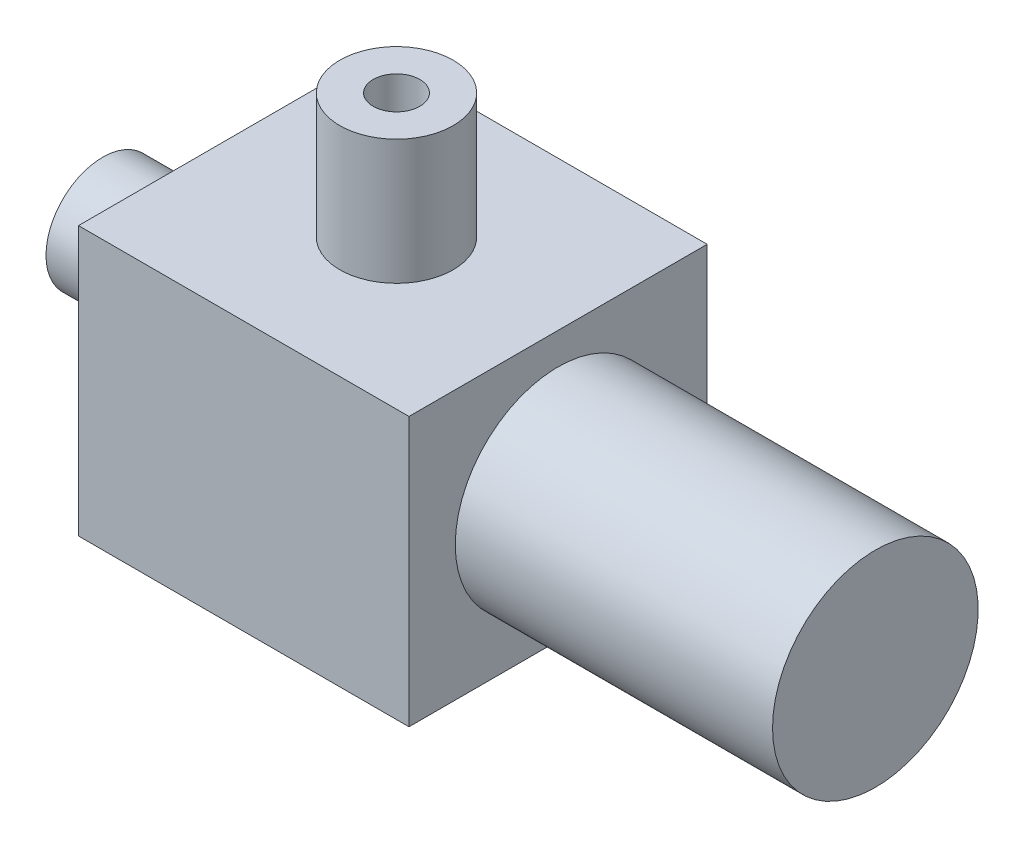
ISO-10303-21;
HEADER;
FILE_DESCRIPTION(('STEP AP214'),'2;1');
FILE_NAME('part.step','',(''),(''),'','','');
FILE_SCHEMA(('AUTOMOTIVE_DESIGN { 1 0 10303 214 1 1 1 1 }'));
ENDSEC;
DATA;
#1=APPLICATION_CONTEXT('core data for automotive mechanical design processes');
#2=APPLICATION_PROTOCOL_DEFINITION('international standard','automotive_design',2000,#1);
#3=PRODUCT_CONTEXT('',#1,'mechanical');
#4=PRODUCT('Part','Part','',(#3));
#5=PRODUCT_RELATED_PRODUCT_CATEGORY('part','',(#4));
#6=PRODUCT_DEFINITION_FORMATION('','',#4);
#7=PRODUCT_DEFINITION_CONTEXT('part definition',#1,'design');
#8=PRODUCT_DEFINITION('design','',#6,#7);
#9=PRODUCT_DEFINITION_SHAPE('','',#8);
#10=(LENGTH_UNIT() NAMED_UNIT(*) SI_UNIT(.MILLI.,.METRE.));
#11=(NAMED_UNIT(*) PLANE_ANGLE_UNIT() SI_UNIT($,.RADIAN.));
#12=(NAMED_UNIT(*) SI_UNIT($,.STERADIAN.) SOLID_ANGLE_UNIT());
#13=UNCERTAINTY_MEASURE_WITH_UNIT(LENGTH_MEASURE(1.E-05),#10,'distance_accuracy_value','');
#14=(GEOMETRIC_REPRESENTATION_CONTEXT(3) GLOBAL_UNCERTAINTY_ASSIGNED_CONTEXT((#13)) GLOBAL_UNIT_ASSIGNED_CONTEXT((#10,
#11,#12)) REPRESENTATION_CONTEXT('',''));
#15=CARTESIAN_POINT('',(0.,0.,0.));
#16=DIRECTION('',(0.,0.,1.));
#17=DIRECTION('',(1.,0.,0.));
#18=AXIS2_PLACEMENT_3D('',#15,#16,#17);
#19=CARTESIAN_POINT('',(17.,18.3,20.3));
#20=DIRECTION('',(1.,0.,0.));
#21=DIRECTION('',(0.,0.,-1.));
#22=AXIS2_PLACEMENT_3D('',#19,#20,#21);
#23=PLANE('',#22);
#24=CARTESIAN_POINT('',(16.9999999999999,0.,0.));
#25=DIRECTION('',(-1.,0.,0.));
#26=DIRECTION('',(0.,0.,1.));
#27=AXIS2_PLACEMENT_3D('',#24,#25,#26);
#28=CIRCLE('',#27,7.722);
#29=CARTESIAN_POINT('',(16.9999999999999,0.,7.722));
#30=VERTEX_POINT('',#29);
#31=EDGE_CURVE('E11',#30,#30,#28,.T.);
#32=ORIENTED_EDGE('',*,*,#31,.F.);
#33=EDGE_LOOP('',(#32));
#34=FACE_BOUND('',#33,.T.);
#35=DIRECTION('',(0.,-1.,0.));
#36=VECTOR('',#35,1.);
#37=CARTESIAN_POINT('',(17.,18.3,-20.3));
#38=LINE('',#37,#36);
#39=CARTESIAN_POINT('',(17.,18.3,-20.3));
#40=VERTEX_POINT('',#39);
#41=CARTESIAN_POINT('',(17.,-18.3,-20.3));
#42=VERTEX_POINT('',#41);
#43=EDGE_CURVE('E107',#40,#42,#38,.T.);
#44=ORIENTED_EDGE('',*,*,#43,.T.);
#45=DIRECTION('',(0.,0.,-1.));
#46=VECTOR('',#45,1.);
#47=CARTESIAN_POINT('',(17.,-18.3,20.3));
#48=LINE('',#47,#46);
#49=CARTESIAN_POINT('',(17.,-18.3,20.3));
#50=VERTEX_POINT('',#49);
#51=EDGE_CURVE('E49',#50,#42,#48,.T.);
#52=ORIENTED_EDGE('',*,*,#51,.F.);
#53=DIRECTION('',(0.,-1.,0.));
#54=VECTOR('',#53,1.);
#55=CARTESIAN_POINT('',(17.,18.3,20.3));
#56=LINE('',#55,#54);
#57=CARTESIAN_POINT('',(17.,18.3,20.3));
#58=VERTEX_POINT('',#57);
#59=EDGE_CURVE('E93',#58,#50,#56,.T.);
#60=ORIENTED_EDGE('',*,*,#59,.F.);
#61=DIRECTION('',(0.,0.,-1.));
#62=VECTOR('',#61,1.);
#63=CARTESIAN_POINT('',(17.,18.3,20.3));
#64=LINE('',#63,#62);
#65=EDGE_CURVE('E102',#58,#40,#64,.T.);
#66=ORIENTED_EDGE('',*,*,#65,.T.);
#67=EDGE_LOOP('',(#44,#52,#60,#66));
#68=FACE_BOUND('',#67,.T.);
#69=ADVANCED_FACE('F41',(#34,#68),#23,.F.);
#70=CARTESIAN_POINT('',(17.,-18.3,20.3));
#71=DIRECTION('',(0.,1.,0.));
#72=DIRECTION('',(0.,0.,1.));
#73=AXIS2_PLACEMENT_3D('',#70,#71,#72);
#74=PLANE('',#73);
#75=DIRECTION('',(1.,0.,0.));
#76=VECTOR('',#75,1.);
#77=CARTESIAN_POINT('',(17.,-18.3,-20.3));
#78=LINE('',#77,#76);
#79=CARTESIAN_POINT('',(62.,-18.3,-20.3));
#80=VERTEX_POINT('',#79);
#81=EDGE_CURVE('E99',#42,#80,#78,.T.);
#82=ORIENTED_EDGE('',*,*,#81,.T.);
#83=DIRECTION('',(0.,0.,-1.));
#84=VECTOR('',#83,1.);
#85=CARTESIAN_POINT('',(62.,-18.3,20.3));
#86=LINE('',#85,#84);
#87=CARTESIAN_POINT('',(62.,-18.3,20.3));
#88=VERTEX_POINT('',#87);
#89=EDGE_CURVE('E96',#88,#80,#86,.T.);
#90=ORIENTED_EDGE('',*,*,#89,.F.);
#91=DIRECTION('',(1.,0.,0.));
#92=VECTOR('',#91,1.);
#93=CARTESIAN_POINT('',(17.,-18.3,20.3));
#94=LINE('',#93,#92);
#95=EDGE_CURVE('E90',#50,#88,#94,.T.);
#96=ORIENTED_EDGE('',*,*,#95,.F.);
#97=ORIENTED_EDGE('',*,*,#51,.T.);
#98=EDGE_LOOP('',(#82,#90,#96,#97));
#99=FACE_BOUND('',#98,.T.);
#100=ADVANCED_FACE('F100',(#99),#74,.F.);
#101=CARTESIAN_POINT('',(62.,-18.3,20.3));
#102=DIRECTION('',(-1.,0.,0.));
#103=DIRECTION('',(0.,0.,1.));
#104=AXIS2_PLACEMENT_3D('',#101,#102,#103);
#105=PLANE('',#104);
#106=CARTESIAN_POINT('',(62.0000000000001,0.,0.));
#107=DIRECTION('',(-1.,0.,0.));
#108=DIRECTION('',(0.,0.,1.));
#109=AXIS2_PLACEMENT_3D('',#106,#107,#108);
#110=CIRCLE('',#109,14.);
#111=CARTESIAN_POINT('',(62.0000000000001,0.,14.));
#112=VERTEX_POINT('',#111);
#113=EDGE_CURVE('E140',#112,#112,#110,.T.);
#114=ORIENTED_EDGE('',*,*,#113,.T.);
#115=EDGE_LOOP('',(#114));
#116=FACE_BOUND('',#115,.T.);
#117=DIRECTION('',(0.,1.,0.));
#118=VECTOR('',#117,1.);
#119=CARTESIAN_POINT('',(62.,-18.3,-20.3));
#120=LINE('',#119,#118);
#121=CARTESIAN_POINT('',(62.,18.3,-20.3));
#122=VERTEX_POINT('',#121);
#123=EDGE_CURVE('E77',#80,#122,#120,.T.);
#124=ORIENTED_EDGE('',*,*,#123,.T.);
#125=DIRECTION('',(0.,0.,-1.));
#126=VECTOR('',#125,1.);
#127=CARTESIAN_POINT('',(62.,18.3,20.3));
#128=LINE('',#127,#126);
#129=CARTESIAN_POINT('',(62.,18.3,20.3));
#130=VERTEX_POINT('',#129);
#131=EDGE_CURVE('E103',#130,#122,#128,.T.);
#132=ORIENTED_EDGE('',*,*,#131,.F.);
#133=DIRECTION('',(0.,1.,0.));
#134=VECTOR('',#133,1.);
#135=CARTESIAN_POINT('',(62.,-18.3,20.3));
#136=LINE('',#135,#134);
#137=EDGE_CURVE('E94',#88,#130,#136,.T.);
#138=ORIENTED_EDGE('',*,*,#137,.F.);
#139=ORIENTED_EDGE('',*,*,#89,.T.);
#140=EDGE_LOOP('',(#124,#132,#138,#139));
#141=FACE_BOUND('',#140,.T.);
#142=ADVANCED_FACE('F101',(#116,#141),#105,.F.);
#143=CARTESIAN_POINT('',(62.,18.3,20.3));
#144=DIRECTION('',(0.,-1.,0.));
#145=DIRECTION('',(0.,0.,-1.));
#146=AXIS2_PLACEMENT_3D('',#143,#144,#145);
#147=PLANE('',#146);
#148=CARTESIAN_POINT('',(40.,18.3,0.));
#149=DIRECTION('',(0.,-1.,0.));
#150=DIRECTION('',(0.,0.,-1.));
#151=AXIS2_PLACEMENT_3D('',#148,#149,#150);
#152=CIRCLE('',#151,7.722);
#153=CARTESIAN_POINT('',(40.,18.3,-7.722));
#154=VERTEX_POINT('',#153);
#155=EDGE_CURVE('E123',#154,#154,#152,.T.);
#156=ORIENTED_EDGE('',*,*,#155,.T.);
#157=EDGE_LOOP('',(#156));
#158=FACE_BOUND('',#157,.T.);
#159=DIRECTION('',(-1.,0.,0.));
#160=VECTOR('',#159,1.);
#161=CARTESIAN_POINT('',(62.,18.3,-20.3));
#162=LINE('',#161,#160);
#163=EDGE_CURVE('E85',#122,#40,#162,.T.);
#164=ORIENTED_EDGE('',*,*,#163,.T.);
#165=ORIENTED_EDGE('',*,*,#65,.F.);
#166=DIRECTION('',(-1.,0.,0.));
#167=VECTOR('',#166,1.);
#168=CARTESIAN_POINT('',(62.,18.3,20.3));
#169=LINE('',#168,#167);
#170=EDGE_CURVE('E56',#130,#58,#169,.T.);
#171=ORIENTED_EDGE('',*,*,#170,.F.);
#172=ORIENTED_EDGE('',*,*,#131,.T.);
#173=EDGE_LOOP('',(#164,#165,#171,#172));
#174=FACE_BOUND('',#173,.T.);
#175=ADVANCED_FACE('F166',(#158,#174),#147,.F.);
#176=CARTESIAN_POINT('',(0.,0.,20.3));
#177=DIRECTION('',(0.,0.,1.));
#178=DIRECTION('',(1.,0.,0.));
#179=AXIS2_PLACEMENT_3D('',#176,#177,#178);
#180=PLANE('',#179);
#181=ORIENTED_EDGE('',*,*,#59,.T.);
#182=ORIENTED_EDGE('',*,*,#95,.T.);
#183=ORIENTED_EDGE('',*,*,#137,.T.);
#184=ORIENTED_EDGE('',*,*,#170,.T.);
#185=EDGE_LOOP('',(#181,#182,#183,#184));
#186=FACE_BOUND('',#185,.T.);
#187=ADVANCED_FACE('F92',(#186),#180,.T.);
#188=CARTESIAN_POINT('',(0.,0.,-20.3));
#189=DIRECTION('',(0.,0.,1.));
#190=DIRECTION('',(1.,0.,0.));
#191=AXIS2_PLACEMENT_3D('',#188,#189,#190);
#192=PLANE('',#191);
#193=ORIENTED_EDGE('',*,*,#43,.F.);
#194=ORIENTED_EDGE('',*,*,#163,.F.);
#195=ORIENTED_EDGE('',*,*,#123,.F.);
#196=ORIENTED_EDGE('',*,*,#81,.F.);
#197=EDGE_LOOP('',(#193,#194,#195,#196));
#198=FACE_BOUND('',#197,.T.);
#199=ADVANCED_FACE('F156',(#198),#192,.F.);
#200=CARTESIAN_POINT('',(0.,7.722,0.));
#201=DIRECTION('',(1.,0.,0.));
#202=DIRECTION('',(0.,0.,-1.));
#203=AXIS2_PLACEMENT_3D('',#200,#201,#202);
#204=PLANE('',#203);
#205=CARTESIAN_POINT('',(0.,0.,0.));
#206=DIRECTION('',(1.,0.,0.));
#207=DIRECTION('',(0.,0.,-1.));
#208=AXIS2_PLACEMENT_3D('',#205,#206,#207);
#209=CIRCLE('',#208,3.175);
#210=CARTESIAN_POINT('',(0.,0.,-3.175));
#211=VERTEX_POINT('',#210);
#212=EDGE_CURVE('E117',#211,#211,#209,.F.);
#213=ORIENTED_EDGE('',*,*,#212,.F.);
#214=EDGE_LOOP('',(#213));
#215=FACE_BOUND('',#214,.T.);
#216=CARTESIAN_POINT('',(0.,0.,0.));
#217=DIRECTION('',(-1.,0.,0.));
#218=DIRECTION('',(0.,0.,1.));
#219=AXIS2_PLACEMENT_3D('',#216,#217,#218);
#220=CIRCLE('',#219,7.722);
#221=CARTESIAN_POINT('',(0.,0.,7.722));
#222=VERTEX_POINT('',#221);
#223=EDGE_CURVE('E115',#222,#222,#220,.T.);
#224=ORIENTED_EDGE('',*,*,#223,.T.);
#225=EDGE_LOOP('',(#224));
#226=FACE_BOUND('',#225,.T.);
#227=ADVANCED_FACE('F147',(#215,#226),#204,.F.);
#228=CARTESIAN_POINT('',(-1000.,0.,0.));
#229=DIRECTION('',(-1.,0.,0.));
#230=DIRECTION('',(0.,0.,1.));
#231=AXIS2_PLACEMENT_3D('',#228,#229,#230);
#232=CYLINDRICAL_SURFACE('',#231,7.722);
#233=ORIENTED_EDGE('',*,*,#223,.F.);
#234=EDGE_LOOP('',(#233));
#235=FACE_BOUND('',#234,.T.);
#236=ORIENTED_EDGE('',*,*,#31,.T.);
#237=EDGE_LOOP('',(#236));
#238=FACE_BOUND('',#237,.T.);
#239=ADVANCED_FACE('F149',(#235,#238),#232,.T.);
#240=CARTESIAN_POINT('',(105.2,0.,0.));
#241=DIRECTION('',(-1.,0.,0.));
#242=DIRECTION('',(0.,0.,1.));
#243=AXIS2_PLACEMENT_3D('',#240,#241,#242);
#244=PLANE('',#243);
#245=CARTESIAN_POINT('',(105.2,0.,0.));
#246=DIRECTION('',(-1.,0.,0.));
#247=DIRECTION('',(0.,0.,1.));
#248=AXIS2_PLACEMENT_3D('',#245,#246,#247);
#249=CIRCLE('',#248,14.);
#250=CARTESIAN_POINT('',(105.2,0.,14.));
#251=VERTEX_POINT('',#250);
#252=EDGE_CURVE('E138',#251,#251,#249,.T.);
#253=ORIENTED_EDGE('',*,*,#252,.F.);
#254=EDGE_LOOP('',(#253));
#255=FACE_BOUND('',#254,.T.);
#256=ADVANCED_FACE('F151',(#255),#244,.F.);
#257=CARTESIAN_POINT('',(-1000.,0.,0.));
#258=DIRECTION('',(-1.,0.,0.));
#259=DIRECTION('',(0.,0.,1.));
#260=AXIS2_PLACEMENT_3D('',#257,#258,#259);
#261=CYLINDRICAL_SURFACE('',#260,14.);
#262=ORIENTED_EDGE('',*,*,#113,.F.);
#263=EDGE_LOOP('',(#262));
#264=FACE_BOUND('',#263,.T.);
#265=ORIENTED_EDGE('',*,*,#252,.T.);
#266=EDGE_LOOP('',(#265));
#267=FACE_BOUND('',#266,.T.);
#268=ADVANCED_FACE('F219',(#264,#267),#261,.T.);
#269=CARTESIAN_POINT('',(40.,0.,0.));
#270=DIRECTION('',(0.,-1.,0.));
#271=DIRECTION('',(0.,0.,-1.));
#272=AXIS2_PLACEMENT_3D('',#269,#270,#271);
#273=CYLINDRICAL_SURFACE('',#272,7.722);
#274=CARTESIAN_POINT('',(40.,35.3,0.));
#275=DIRECTION('',(0.,-1.,0.));
#276=DIRECTION('',(0.,0.,-1.));
#277=AXIS2_PLACEMENT_3D('',#274,#275,#276);
#278=CIRCLE('',#277,7.722);
#279=CARTESIAN_POINT('',(40.,35.3,-7.722));
#280=VERTEX_POINT('',#279);
#281=EDGE_CURVE('E119',#280,#280,#278,.T.);
#282=ORIENTED_EDGE('',*,*,#281,.T.);
#283=EDGE_LOOP('',(#282));
#284=FACE_BOUND('',#283,.T.);
#285=ORIENTED_EDGE('',*,*,#155,.F.);
#286=EDGE_LOOP('',(#285));
#287=FACE_BOUND('',#286,.T.);
#288=ADVANCED_FACE('F226',(#284,#287),#273,.T.);
#289=CARTESIAN_POINT('',(47.722,35.3,0.));
#290=DIRECTION('',(0.,1.,0.));
#291=DIRECTION('',(0.,0.,1.));
#292=AXIS2_PLACEMENT_3D('',#289,#290,#291);
#293=PLANE('',#292);
#294=CARTESIAN_POINT('',(40.,35.3,0.));
#295=DIRECTION('',(0.,1.,0.));
#296=DIRECTION('',(0.,0.,1.));
#297=AXIS2_PLACEMENT_3D('',#294,#295,#296);
#298=CIRCLE('',#297,3.175);
#299=CARTESIAN_POINT('',(40.,35.3,3.175));
#300=VERTEX_POINT('',#299);
#301=EDGE_CURVE('E42',#300,#300,#298,.T.);
#302=ORIENTED_EDGE('',*,*,#301,.F.);
#303=EDGE_LOOP('',(#302));
#304=FACE_BOUND('',#303,.T.);
#305=ORIENTED_EDGE('',*,*,#281,.F.);
#306=EDGE_LOOP('',(#305));
#307=FACE_BOUND('',#306,.T.);
#308=ADVANCED_FACE('F240',(#304,#307),#293,.T.);
#309=CARTESIAN_POINT('',(-1000.,0.,0.));
#310=DIRECTION('',(-1.,0.,0.));
#311=DIRECTION('',(0.,0.,1.));
#312=AXIS2_PLACEMENT_3D('',#309,#310,#311);
#313=CYLINDRICAL_SURFACE('',#312,3.175);
#314=CARTESIAN_POINT('',(15.2000000000001,0.,0.));
#315=DIRECTION('',(-1.,0.,0.));
#316=DIRECTION('',(0.,0.,1.));
#317=AXIS2_PLACEMENT_3D('',#314,#315,#316);
#318=CIRCLE('',#317,3.175);
#319=CARTESIAN_POINT('',(15.2000000000001,0.,3.175));
#320=VERTEX_POINT('',#319);
#321=EDGE_CURVE('E122',#320,#320,#318,.T.);
#322=ORIENTED_EDGE('',*,*,#321,.F.);
#323=EDGE_LOOP('',(#322));
#324=FACE_BOUND('',#323,.T.);
#325=ORIENTED_EDGE('',*,*,#212,.T.);
#326=EDGE_LOOP('',(#325));
#327=FACE_BOUND('',#326,.T.);
#328=ADVANCED_FACE('F250',(#324,#327),#313,.F.);
#329=CARTESIAN_POINT('',(15.2,0.,0.));
#330=DIRECTION('',(-1.,0.,0.));
#331=DIRECTION('',(0.,0.,1.));
#332=AXIS2_PLACEMENT_3D('',#329,#330,#331);
#333=PLANE('',#332);
#334=ORIENTED_EDGE('',*,*,#321,.T.);
#335=EDGE_LOOP('',(#334));
#336=FACE_BOUND('',#335,.T.);
#337=ADVANCED_FACE('F259',(#336),#333,.T.);
#338=CARTESIAN_POINT('',(40.,20.1,0.));
#339=DIRECTION('',(0.,-1.,0.));
#340=DIRECTION('',(0.,0.,-1.));
#341=AXIS2_PLACEMENT_3D('',#338,#339,#340);
#342=PLANE('',#341);
#343=CARTESIAN_POINT('',(40.,20.1,0.));
#344=DIRECTION('',(0.,-1.,0.));
#345=DIRECTION('',(0.,0.,-1.));
#346=AXIS2_PLACEMENT_3D('',#343,#344,#345);
#347=CIRCLE('',#346,3.175);
#348=CARTESIAN_POINT('',(40.,20.1,-3.175));
#349=VERTEX_POINT('',#348);
#350=EDGE_CURVE('E132',#349,#349,#347,.T.);
#351=ORIENTED_EDGE('',*,*,#350,.F.);
#352=EDGE_LOOP('',(#351));
#353=FACE_BOUND('',#352,.T.);
#354=ADVANCED_FACE('F270',(#353),#342,.F.);
#355=CARTESIAN_POINT('',(40.,0.,0.));
#356=DIRECTION('',(0.,-1.,0.));
#357=DIRECTION('',(0.,0.,-1.));
#358=AXIS2_PLACEMENT_3D('',#355,#356,#357);
#359=CYLINDRICAL_SURFACE('',#358,3.175);
#360=ORIENTED_EDGE('',*,*,#301,.T.);
#361=EDGE_LOOP('',(#360));
#362=FACE_BOUND('',#361,.T.);
#363=ORIENTED_EDGE('',*,*,#350,.T.);
#364=EDGE_LOOP('',(#363));
#365=FACE_BOUND('',#364,.T.);
#366=ADVANCED_FACE('F273',(#362,#365),#359,.F.);
#367=CLOSED_SHELL('',(#69,#100,#142,#175,#187,#199,#227,#239,#256,#268,#288,#308,#328,#337,#354,#366));
#368=MANIFOLD_SOLID_BREP('B2',#367);
#369=ADVANCED_BREP_SHAPE_REPRESENTATION('',(#18,#368),#14);
#370=SHAPE_DEFINITION_REPRESENTATION(#9,#369);
ENDSEC;
END-ISO-10303-21;
